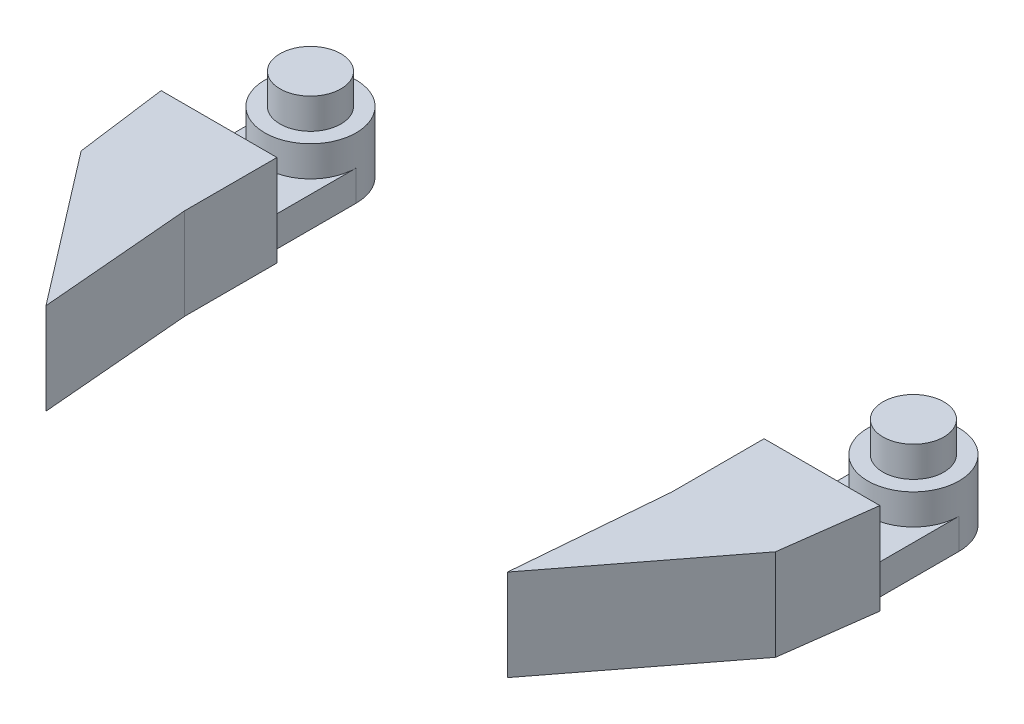
ISO-10303-21;
HEADER;
FILE_DESCRIPTION(('STEP AP214'),'2;1');
FILE_NAME('part.step','',(''),(''),'','','');
FILE_SCHEMA(('AUTOMOTIVE_DESIGN { 1 0 10303 214 1 1 1 1 }'));
ENDSEC;
DATA;
#1=APPLICATION_CONTEXT('core data for automotive mechanical design processes');
#2=APPLICATION_PROTOCOL_DEFINITION('international standard','automotive_design',2000,#1);
#3=PRODUCT_CONTEXT('',#1,'mechanical');
#4=PRODUCT('Part','Part','',(#3));
#5=PRODUCT_RELATED_PRODUCT_CATEGORY('part','',(#4));
#6=PRODUCT_DEFINITION_FORMATION('','',#4);
#7=PRODUCT_DEFINITION_CONTEXT('part definition',#1,'design');
#8=PRODUCT_DEFINITION('design','',#6,#7);
#9=PRODUCT_DEFINITION_SHAPE('','',#8);
#10=(LENGTH_UNIT() NAMED_UNIT(*) SI_UNIT(.MILLI.,.METRE.));
#11=(NAMED_UNIT(*) PLANE_ANGLE_UNIT() SI_UNIT($,.RADIAN.));
#12=(NAMED_UNIT(*) SI_UNIT($,.STERADIAN.) SOLID_ANGLE_UNIT());
#13=UNCERTAINTY_MEASURE_WITH_UNIT(LENGTH_MEASURE(1.E-05),#10,'distance_accuracy_value','');
#14=(GEOMETRIC_REPRESENTATION_CONTEXT(3) GLOBAL_UNCERTAINTY_ASSIGNED_CONTEXT((#13)) GLOBAL_UNIT_ASSIGNED_CONTEXT((#10,
#11,#12)) REPRESENTATION_CONTEXT('',''));
#15=CARTESIAN_POINT('',(0.,0.,0.));
#16=DIRECTION('',(0.,0.,1.));
#17=DIRECTION('',(1.,0.,0.));
#18=AXIS2_PLACEMENT_3D('',#15,#16,#17);
#19=CARTESIAN_POINT('',(98.9290186333893,15.,0.));
#20=DIRECTION('',(0.,-1.,0.));
#21=DIRECTION('',(0.,0.,-1.));
#22=AXIS2_PLACEMENT_3D('',#19,#20,#21);
#23=CYLINDRICAL_SURFACE('',#22,5.);
#24=CARTESIAN_POINT('',(98.9290186333893,10.,0.));
#25=DIRECTION('',(0.,1.,0.));
#26=DIRECTION('',(0.,0.,1.));
#27=AXIS2_PLACEMENT_3D('',#24,#25,#26);
#28=CIRCLE('',#27,5.);
#29=CARTESIAN_POINT('',(98.9290186333893,10.,5.));
#30=VERTEX_POINT('',#29);
#31=EDGE_CURVE('E12',#30,#30,#28,.F.);
#32=ORIENTED_EDGE('',*,*,#31,.F.);
#33=EDGE_LOOP('',(#32));
#34=FACE_BOUND('',#33,.T.);
#35=CARTESIAN_POINT('',(98.9290186333893,15.,0.));
#36=DIRECTION('',(0.,1.,0.));
#37=DIRECTION('',(0.,0.,1.));
#38=AXIS2_PLACEMENT_3D('',#35,#36,#37);
#39=CIRCLE('',#38,5.);
#40=CARTESIAN_POINT('',(98.9290186333893,15.,5.));
#41=VERTEX_POINT('',#40);
#42=EDGE_CURVE('E52',#41,#41,#39,.F.);
#43=ORIENTED_EDGE('',*,*,#42,.T.);
#44=EDGE_LOOP('',(#43));
#45=FACE_BOUND('',#44,.T.);
#46=ADVANCED_FACE('F45',(#34,#45),#23,.T.);
#47=CARTESIAN_POINT('',(0.,15.,0.));
#48=DIRECTION('',(0.,1.,0.));
#49=DIRECTION('',(0.,0.,1.));
#50=AXIS2_PLACEMENT_3D('',#47,#48,#49);
#51=PLANE('',#50);
#52=ORIENTED_EDGE('',*,*,#42,.F.);
#53=EDGE_LOOP('',(#52));
#54=FACE_BOUND('',#53,.T.);
#55=ADVANCED_FACE('F200',(#54),#51,.T.);
#56=CARTESIAN_POINT('',(98.9290186333893,10.,0.));
#57=DIRECTION('',(0.,-1.,0.));
#58=DIRECTION('',(0.,0.,-1.));
#59=AXIS2_PLACEMENT_3D('',#56,#57,#58);
#60=CYLINDRICAL_SURFACE('',#59,7.5);
#61=DIRECTION('',(0.,-1.,0.));
#62=VECTOR('',#61,1.);
#63=CARTESIAN_POINT('',(106.429018633389,5.,0.));
#64=LINE('',#63,#62);
#65=CARTESIAN_POINT('',(106.429018633389,5.,0.));
#66=VERTEX_POINT('',#65);
#67=CARTESIAN_POINT('',(106.429018633389,0.,0.));
#68=VERTEX_POINT('',#67);
#69=EDGE_CURVE('E85',#66,#68,#64,.T.);
#70=ORIENTED_EDGE('',*,*,#69,.T.);
#71=CARTESIAN_POINT('',(98.9290186333893,0.,0.));
#72=DIRECTION('',(0.,1.,0.));
#73=DIRECTION('',(0.,0.,1.));
#74=AXIS2_PLACEMENT_3D('',#71,#72,#73);
#75=CIRCLE('',#74,7.5);
#76=CARTESIAN_POINT('',(91.4290186333893,0.,0.));
#77=VERTEX_POINT('',#76);
#78=EDGE_CURVE('E192',#77,#68,#75,.F.);
#79=ORIENTED_EDGE('',*,*,#78,.F.);
#80=DIRECTION('',(0.,-1.,0.));
#81=VECTOR('',#80,1.);
#82=CARTESIAN_POINT('',(91.4290186333893,5.,0.));
#83=LINE('',#82,#81);
#84=CARTESIAN_POINT('',(91.4290186333893,5.,0.));
#85=VERTEX_POINT('',#84);
#86=EDGE_CURVE('E189',#85,#77,#83,.T.);
#87=ORIENTED_EDGE('',*,*,#86,.F.);
#88=CARTESIAN_POINT('',(98.9290186333893,5.,0.));
#89=DIRECTION('',(0.,1.,0.));
#90=DIRECTION('',(0.,0.,1.));
#91=AXIS2_PLACEMENT_3D('',#88,#89,#90);
#92=CIRCLE('',#91,7.5);
#93=EDGE_CURVE('E176',#66,#85,#92,.F.);
#94=ORIENTED_EDGE('',*,*,#93,.F.);
#95=EDGE_LOOP('',(#70,#79,#87,#94));
#96=FACE_BOUND('',#95,.T.);
#97=CARTESIAN_POINT('',(98.9290186333893,10.,0.));
#98=DIRECTION('',(0.,1.,0.));
#99=DIRECTION('',(0.,0.,1.));
#100=AXIS2_PLACEMENT_3D('',#97,#98,#99);
#101=CIRCLE('',#100,7.5);
#102=CARTESIAN_POINT('',(98.9290186333893,10.,7.5));
#103=VERTEX_POINT('',#102);
#104=EDGE_CURVE('E193',#103,#103,#101,.F.);
#105=ORIENTED_EDGE('',*,*,#104,.T.);
#106=EDGE_LOOP('',(#105));
#107=FACE_BOUND('',#106,.T.);
#108=ADVANCED_FACE('F202',(#96,#107),#60,.T.);
#109=CARTESIAN_POINT('',(0.,10.,0.));
#110=DIRECTION('',(0.,1.,0.));
#111=DIRECTION('',(0.,0.,1.));
#112=AXIS2_PLACEMENT_3D('',#109,#110,#111);
#113=PLANE('',#112);
#114=ORIENTED_EDGE('',*,*,#31,.T.);
#115=EDGE_LOOP('',(#114));
#116=FACE_BOUND('',#115,.T.);
#117=ORIENTED_EDGE('',*,*,#104,.F.);
#118=EDGE_LOOP('',(#117));
#119=FACE_BOUND('',#118,.T.);
#120=ADVANCED_FACE('F208',(#116,#119),#113,.T.);
#121=CARTESIAN_POINT('',(0.,0.,0.));
#122=DIRECTION('',(0.,1.,0.));
#123=DIRECTION('',(0.,0.,1.));
#124=AXIS2_PLACEMENT_3D('',#121,#122,#123);
#125=PLANE('',#124);
#126=ORIENTED_EDGE('',*,*,#78,.T.);
#127=DIRECTION('',(0.,0.,1.));
#128=VECTOR('',#127,1.);
#129=CARTESIAN_POINT('',(106.429018633389,0.,0.));
#130=LINE('',#129,#128);
#131=CARTESIAN_POINT('',(106.429018633389,0.,15.));
#132=VERTEX_POINT('',#131);
#133=EDGE_CURVE('E132',#68,#132,#130,.T.);
#134=ORIENTED_EDGE('',*,*,#133,.T.);
#135=DIRECTION('',(1.,0.,0.));
#136=VECTOR('',#135,1.);
#137=CARTESIAN_POINT('',(0.,0.,15.));
#138=LINE('',#137,#136);
#139=CARTESIAN_POINT('',(108.429018633389,0.,15.));
#140=VERTEX_POINT('',#139);
#141=EDGE_CURVE('E158',#132,#140,#138,.T.);
#142=ORIENTED_EDGE('',*,*,#141,.T.);
#143=DIRECTION('',(-0.131071920752448,0.,0.991372862040445));
#144=VECTOR('',#143,1.);
#145=CARTESIAN_POINT('',(108.515341708194,0.,14.3470885813101));
#146=LINE('',#145,#144);
#147=CARTESIAN_POINT('',(106.429018633389,0.,30.1271585302061));
#148=VERTEX_POINT('',#147);
#149=EDGE_CURVE('E128',#140,#148,#146,.T.);
#150=ORIENTED_EDGE('',*,*,#149,.T.);
#151=DIRECTION('',(-0.609198044114665,0.,0.793018122773286));
#152=VECTOR('',#151,1.);
#153=CARTESIAN_POINT('',(81.4854246461835,0.,62.5972596246702));
#154=LINE('',#153,#152);
#155=CARTESIAN_POINT('',(87.3216540728135,0.,55.));
#156=VERTEX_POINT('',#155);
#157=EDGE_CURVE('E144',#148,#156,#154,.T.);
#158=ORIENTED_EDGE('',*,*,#157,.T.);
#159=DIRECTION('',(0.0844230553486425,0.,-0.996430001417862));
#160=VECTOR('',#159,1.);
#161=CARTESIAN_POINT('',(91.3259821990599,0.,7.73764182028789));
#162=LINE('',#161,#160);
#163=CARTESIAN_POINT('',(89.4290186333893,0.,30.1271585302061));
#164=VERTEX_POINT('',#163);
#165=EDGE_CURVE('E164',#156,#164,#162,.T.);
#166=ORIENTED_EDGE('',*,*,#165,.T.);
#167=DIRECTION('',(0.,0.,-1.));
#168=VECTOR('',#167,1.);
#169=CARTESIAN_POINT('',(89.4290186333893,0.,0.));
#170=LINE('',#169,#168);
#171=CARTESIAN_POINT('',(89.4290186333893,0.,15.));
#172=VERTEX_POINT('',#171);
#173=EDGE_CURVE('E161',#164,#172,#170,.T.);
#174=ORIENTED_EDGE('',*,*,#173,.T.);
#175=CARTESIAN_POINT('',(91.4290186333893,0.,15.));
#176=VERTEX_POINT('',#175);
#177=EDGE_CURVE('E159',#172,#176,#138,.T.);
#178=ORIENTED_EDGE('',*,*,#177,.T.);
#179=DIRECTION('',(0.,0.,1.));
#180=VECTOR('',#179,1.);
#181=CARTESIAN_POINT('',(91.4290186333893,0.,0.));
#182=LINE('',#181,#180);
#183=EDGE_CURVE('E59',#77,#176,#182,.T.);
#184=ORIENTED_EDGE('',*,*,#183,.F.);
#185=EDGE_LOOP('',(#126,#134,#142,#150,#158,#166,#174,#178,#184));
#186=FACE_BOUND('',#185,.T.);
#187=ADVANCED_FACE('F213',(#186),#125,.F.);
#188=CARTESIAN_POINT('',(106.429018633389,5.,0.));
#189=DIRECTION('',(1.,0.,0.));
#190=DIRECTION('',(0.,0.,-1.));
#191=AXIS2_PLACEMENT_3D('',#188,#189,#190);
#192=PLANE('',#191);
#193=ORIENTED_EDGE('',*,*,#133,.F.);
#194=ORIENTED_EDGE('',*,*,#69,.F.);
#195=DIRECTION('',(0.,0.,1.));
#196=VECTOR('',#195,1.);
#197=CARTESIAN_POINT('',(106.429018633389,5.,0.));
#198=LINE('',#197,#196);
#199=CARTESIAN_POINT('',(106.429018633389,5.,15.));
#200=VERTEX_POINT('',#199);
#201=EDGE_CURVE('E68',#66,#200,#198,.T.);
#202=ORIENTED_EDGE('',*,*,#201,.T.);
#203=DIRECTION('',(0.,-1.,0.));
#204=VECTOR('',#203,1.);
#205=CARTESIAN_POINT('',(106.429018633389,5.,15.));
#206=LINE('',#205,#204);
#207=EDGE_CURVE('E81',#200,#132,#206,.T.);
#208=ORIENTED_EDGE('',*,*,#207,.T.);
#209=EDGE_LOOP('',(#193,#194,#202,#208));
#210=FACE_BOUND('',#209,.T.);
#211=ADVANCED_FACE('F215',(#210),#192,.T.);
#212=CARTESIAN_POINT('',(91.4290186333893,5.,0.));
#213=DIRECTION('',(1.,0.,0.));
#214=DIRECTION('',(0.,0.,-1.));
#215=AXIS2_PLACEMENT_3D('',#212,#213,#214);
#216=PLANE('',#215);
#217=ORIENTED_EDGE('',*,*,#183,.T.);
#218=DIRECTION('',(0.,-1.,0.));
#219=VECTOR('',#218,1.);
#220=CARTESIAN_POINT('',(91.4290186333893,5.,15.));
#221=LINE('',#220,#219);
#222=CARTESIAN_POINT('',(91.4290186333893,5.,15.));
#223=VERTEX_POINT('',#222);
#224=EDGE_CURVE('E186',#223,#176,#221,.T.);
#225=ORIENTED_EDGE('',*,*,#224,.F.);
#226=DIRECTION('',(0.,0.,1.));
#227=VECTOR('',#226,1.);
#228=CARTESIAN_POINT('',(91.4290186333893,5.,0.));
#229=LINE('',#228,#227);
#230=EDGE_CURVE('E178',#85,#223,#229,.T.);
#231=ORIENTED_EDGE('',*,*,#230,.F.);
#232=ORIENTED_EDGE('',*,*,#86,.T.);
#233=EDGE_LOOP('',(#217,#225,#231,#232));
#234=FACE_BOUND('',#233,.T.);
#235=ADVANCED_FACE('F220',(#234),#216,.F.);
#236=CARTESIAN_POINT('',(0.,5.,0.));
#237=DIRECTION('',(0.,1.,0.));
#238=DIRECTION('',(0.,0.,1.));
#239=AXIS2_PLACEMENT_3D('',#236,#237,#238);
#240=PLANE('',#239);
#241=ORIENTED_EDGE('',*,*,#201,.F.);
#242=ORIENTED_EDGE('',*,*,#93,.T.);
#243=ORIENTED_EDGE('',*,*,#230,.T.);
#244=DIRECTION('',(-1.,0.,0.));
#245=VECTOR('',#244,1.);
#246=CARTESIAN_POINT('',(0.,5.,15.));
#247=LINE('',#246,#245);
#248=EDGE_CURVE('E180',#200,#223,#247,.T.);
#249=ORIENTED_EDGE('',*,*,#248,.F.);
#250=EDGE_LOOP('',(#241,#242,#243,#249));
#251=FACE_BOUND('',#250,.T.);
#252=ADVANCED_FACE('F229',(#251),#240,.T.);
#253=CARTESIAN_POINT('',(0.,15.,15.));
#254=DIRECTION('',(0.,0.,-1.));
#255=DIRECTION('',(-1.,0.,0.));
#256=AXIS2_PLACEMENT_3D('',#253,#254,#255);
#257=PLANE('',#256);
#258=ORIENTED_EDGE('',*,*,#207,.F.);
#259=ORIENTED_EDGE('',*,*,#248,.T.);
#260=ORIENTED_EDGE('',*,*,#224,.T.);
#261=ORIENTED_EDGE('',*,*,#177,.F.);
#262=DIRECTION('',(0.,-1.,0.));
#263=VECTOR('',#262,1.);
#264=CARTESIAN_POINT('',(89.4290186333893,15.,15.));
#265=LINE('',#264,#263);
#266=CARTESIAN_POINT('',(89.4290186333893,15.,15.));
#267=VERTEX_POINT('',#266);
#268=EDGE_CURVE('E133',#267,#172,#265,.T.);
#269=ORIENTED_EDGE('',*,*,#268,.F.);
#270=DIRECTION('',(1.,0.,0.));
#271=VECTOR('',#270,1.);
#272=CARTESIAN_POINT('',(0.,15.,15.));
#273=LINE('',#272,#271);
#274=CARTESIAN_POINT('',(108.429018633389,15.,15.));
#275=VERTEX_POINT('',#274);
#276=EDGE_CURVE('E139',#267,#275,#273,.T.);
#277=ORIENTED_EDGE('',*,*,#276,.T.);
#278=DIRECTION('',(0.,-1.,0.));
#279=VECTOR('',#278,1.);
#280=CARTESIAN_POINT('',(108.429018633389,15.,15.));
#281=LINE('',#280,#279);
#282=EDGE_CURVE('E122',#275,#140,#281,.T.);
#283=ORIENTED_EDGE('',*,*,#282,.T.);
#284=ORIENTED_EDGE('',*,*,#141,.F.);
#285=EDGE_LOOP('',(#258,#259,#260,#261,#269,#277,#283,#284));
#286=FACE_BOUND('',#285,.T.);
#287=ADVANCED_FACE('F146',(#286),#257,.T.);
#288=CARTESIAN_POINT('',(108.515341708194,15.,14.3470885813101));
#289=DIRECTION('',(0.991372862040445,0.,0.131071920752448));
#290=DIRECTION('',(0.131071920752448,0.,-0.991372862040445));
#291=AXIS2_PLACEMENT_3D('',#288,#289,#290);
#292=PLANE('',#291);
#293=ORIENTED_EDGE('',*,*,#149,.F.);
#294=ORIENTED_EDGE('',*,*,#282,.F.);
#295=DIRECTION('',(-0.131071920752448,0.,0.991372862040445));
#296=VECTOR('',#295,1.);
#297=CARTESIAN_POINT('',(108.515341708194,15.,14.3470885813101));
#298=LINE('',#297,#296);
#299=CARTESIAN_POINT('',(106.429018633389,15.,30.1271585302061));
#300=VERTEX_POINT('',#299);
#301=EDGE_CURVE('E125',#275,#300,#298,.T.);
#302=ORIENTED_EDGE('',*,*,#301,.T.);
#303=DIRECTION('',(0.,-1.,0.));
#304=VECTOR('',#303,1.);
#305=CARTESIAN_POINT('',(106.429018633389,15.,30.1271585302061));
#306=LINE('',#305,#304);
#307=EDGE_CURVE('E156',#300,#148,#306,.T.);
#308=ORIENTED_EDGE('',*,*,#307,.T.);
#309=EDGE_LOOP('',(#293,#294,#302,#308));
#310=FACE_BOUND('',#309,.T.);
#311=ADVANCED_FACE('F124',(#310),#292,.T.);
#312=CARTESIAN_POINT('',(89.4290186333893,15.,0.));
#313=DIRECTION('',(-1.,0.,0.));
#314=DIRECTION('',(0.,0.,1.));
#315=AXIS2_PLACEMENT_3D('',#312,#313,#314);
#316=PLANE('',#315);
#317=ORIENTED_EDGE('',*,*,#173,.F.);
#318=DIRECTION('',(0.,-1.,0.));
#319=VECTOR('',#318,1.);
#320=CARTESIAN_POINT('',(89.4290186333893,15.,30.1271585302061));
#321=LINE('',#320,#319);
#322=CARTESIAN_POINT('',(89.4290186333893,15.,30.1271585302061));
#323=VERTEX_POINT('',#322);
#324=EDGE_CURVE('E172',#323,#164,#321,.T.);
#325=ORIENTED_EDGE('',*,*,#324,.F.);
#326=DIRECTION('',(0.,0.,-1.));
#327=VECTOR('',#326,1.);
#328=CARTESIAN_POINT('',(89.4290186333893,15.,0.));
#329=LINE('',#328,#327);
#330=EDGE_CURVE('E148',#323,#267,#329,.T.);
#331=ORIENTED_EDGE('',*,*,#330,.T.);
#332=ORIENTED_EDGE('',*,*,#268,.T.);
#333=EDGE_LOOP('',(#317,#325,#331,#332));
#334=FACE_BOUND('',#333,.T.);
#335=ADVANCED_FACE('F240',(#334),#316,.T.);
#336=CARTESIAN_POINT('',(91.3259821990599,15.,7.73764182028789));
#337=DIRECTION('',(-0.996430001417862,0.,-0.0844230553486425));
#338=DIRECTION('',(-0.0844230553486425,0.,0.996430001417862));
#339=AXIS2_PLACEMENT_3D('',#336,#337,#338);
#340=PLANE('',#339);
#341=ORIENTED_EDGE('',*,*,#165,.F.);
#342=DIRECTION('',(0.,-1.,0.));
#343=VECTOR('',#342,1.);
#344=CARTESIAN_POINT('',(87.3216540728135,15.,55.));
#345=LINE('',#344,#343);
#346=CARTESIAN_POINT('',(87.3216540728135,15.,55.));
#347=VERTEX_POINT('',#346);
#348=EDGE_CURVE('E170',#347,#156,#345,.T.);
#349=ORIENTED_EDGE('',*,*,#348,.F.);
#350=DIRECTION('',(0.0844230553486425,0.,-0.996430001417862));
#351=VECTOR('',#350,1.);
#352=CARTESIAN_POINT('',(91.3259821990599,15.,7.73764182028789));
#353=LINE('',#352,#351);
#354=EDGE_CURVE('E150',#347,#323,#353,.T.);
#355=ORIENTED_EDGE('',*,*,#354,.T.);
#356=ORIENTED_EDGE('',*,*,#324,.T.);
#357=EDGE_LOOP('',(#341,#349,#355,#356));
#358=FACE_BOUND('',#357,.T.);
#359=ADVANCED_FACE('F237',(#358),#340,.T.);
#360=CARTESIAN_POINT('',(81.4854246461835,15.,62.5972596246702));
#361=DIRECTION('',(0.793018122773286,0.,0.609198044114665));
#362=DIRECTION('',(0.609198044114665,0.,-0.793018122773286));
#363=AXIS2_PLACEMENT_3D('',#360,#361,#362);
#364=PLANE('',#363);
#365=ORIENTED_EDGE('',*,*,#157,.F.);
#366=ORIENTED_EDGE('',*,*,#307,.F.);
#367=DIRECTION('',(-0.609198044114665,0.,0.793018122773286));
#368=VECTOR('',#367,1.);
#369=CARTESIAN_POINT('',(81.4854246461835,15.,62.5972596246702));
#370=LINE('',#369,#368);
#371=EDGE_CURVE('E143',#300,#347,#370,.T.);
#372=ORIENTED_EDGE('',*,*,#371,.T.);
#373=ORIENTED_EDGE('',*,*,#348,.T.);
#374=EDGE_LOOP('',(#365,#366,#372,#373));
#375=FACE_BOUND('',#374,.T.);
#376=ADVANCED_FACE('F234',(#375),#364,.T.);
#377=CARTESIAN_POINT('',(0.,15.,0.));
#378=DIRECTION('',(0.,1.,0.));
#379=DIRECTION('',(0.,0.,1.));
#380=AXIS2_PLACEMENT_3D('',#377,#378,#379);
#381=PLANE('',#380);
#382=ORIENTED_EDGE('',*,*,#301,.F.);
#383=ORIENTED_EDGE('',*,*,#276,.F.);
#384=ORIENTED_EDGE('',*,*,#330,.F.);
#385=ORIENTED_EDGE('',*,*,#354,.F.);
#386=ORIENTED_EDGE('',*,*,#371,.F.);
#387=EDGE_LOOP('',(#382,#383,#384,#385,#386));
#388=FACE_BOUND('',#387,.T.);
#389=ADVANCED_FACE('F137',(#388),#381,.T.);
#390=CLOSED_SHELL('',(#46,#55,#108,#120,#187,#211,#235,#252,#287,#311,#335,#359,#376,#389));
#391=MANIFOLD_SOLID_BREP('B2',#390);
#392=CARTESIAN_POINT('',(0.,10.,0.));
#393=DIRECTION('',(0.,-1.,0.));
#394=DIRECTION('',(0.,0.,-1.));
#395=AXIS2_PLACEMENT_3D('',#392,#393,#394);
#396=CYLINDRICAL_SURFACE('',#395,7.5);
#397=CARTESIAN_POINT('',(0.,10.,0.));
#398=DIRECTION('',(0.,1.,0.));
#399=DIRECTION('',(0.,0.,1.));
#400=AXIS2_PLACEMENT_3D('',#397,#398,#399);
#401=CIRCLE('',#400,7.5);
#402=CARTESIAN_POINT('',(0.,10.,7.5));
#403=VERTEX_POINT('',#402);
#404=EDGE_CURVE('E43',#403,#403,#401,.T.);
#405=ORIENTED_EDGE('',*,*,#404,.F.);
#406=EDGE_LOOP('',(#405));
#407=FACE_BOUND('',#406,.T.);
#408=DIRECTION('',(0.,-1.,0.));
#409=VECTOR('',#408,1.);
#410=CARTESIAN_POINT('',(-7.5,5.,0.));
#411=LINE('',#410,#409);
#412=CARTESIAN_POINT('',(-7.5,5.,0.));
#413=VERTEX_POINT('',#412);
#414=CARTESIAN_POINT('',(-7.5,0.,0.));
#415=VERTEX_POINT('',#414);
#416=EDGE_CURVE('E387',#413,#415,#411,.T.);
#417=ORIENTED_EDGE('',*,*,#416,.F.);
#418=CARTESIAN_POINT('',(0.,5.,0.));
#419=DIRECTION('',(0.,1.,0.));
#420=DIRECTION('',(0.,0.,1.));
#421=AXIS2_PLACEMENT_3D('',#418,#419,#420);
#422=CIRCLE('',#421,7.5);
#423=CARTESIAN_POINT('',(7.5,5.,0.));
#424=VERTEX_POINT('',#423);
#425=EDGE_CURVE('E382',#413,#424,#422,.T.);
#426=ORIENTED_EDGE('',*,*,#425,.T.);
#427=DIRECTION('',(0.,-1.,0.));
#428=VECTOR('',#427,1.);
#429=CARTESIAN_POINT('',(7.5,5.,0.));
#430=LINE('',#429,#428);
#431=CARTESIAN_POINT('',(7.5,0.,0.));
#432=VERTEX_POINT('',#431);
#433=EDGE_CURVE('E481',#424,#432,#430,.T.);
#434=ORIENTED_EDGE('',*,*,#433,.T.);
#435=CARTESIAN_POINT('',(0.,0.,0.));
#436=DIRECTION('',(0.,1.,0.));
#437=DIRECTION('',(0.,0.,1.));
#438=AXIS2_PLACEMENT_3D('',#435,#436,#437);
#439=CIRCLE('',#438,7.5);
#440=EDGE_CURVE('E370',#432,#415,#439,.T.);
#441=ORIENTED_EDGE('',*,*,#440,.T.);
#442=EDGE_LOOP('',(#417,#426,#434,#441));
#443=FACE_BOUND('',#442,.T.);
#444=ADVANCED_FACE('F367',(#407,#443),#396,.T.);
#445=CARTESIAN_POINT('',(0.,10.,0.));
#446=DIRECTION('',(0.,1.,0.));
#447=DIRECTION('',(0.,0.,1.));
#448=AXIS2_PLACEMENT_3D('',#445,#446,#447);
#449=PLANE('',#448);
#450=CARTESIAN_POINT('',(0.,10.,0.));
#451=DIRECTION('',(0.,1.,0.));
#452=DIRECTION('',(0.,0.,1.));
#453=AXIS2_PLACEMENT_3D('',#450,#451,#452);
#454=CIRCLE('',#453,5.);
#455=CARTESIAN_POINT('',(0.,10.,5.));
#456=VERTEX_POINT('',#455);
#457=EDGE_CURVE('E375',#456,#456,#454,.T.);
#458=ORIENTED_EDGE('',*,*,#457,.F.);
#459=EDGE_LOOP('',(#458));
#460=FACE_BOUND('',#459,.T.);
#461=ORIENTED_EDGE('',*,*,#404,.T.);
#462=EDGE_LOOP('',(#461));
#463=FACE_BOUND('',#462,.T.);
#464=ADVANCED_FACE('F550',(#460,#463),#449,.T.);
#465=CARTESIAN_POINT('',(0.,0.,0.));
#466=DIRECTION('',(0.,1.,0.));
#467=DIRECTION('',(0.,0.,1.));
#468=AXIS2_PLACEMENT_3D('',#465,#466,#467);
#469=PLANE('',#468);
#470=ORIENTED_EDGE('',*,*,#440,.F.);
#471=DIRECTION('',(0.,0.,1.));
#472=VECTOR('',#471,1.);
#473=CARTESIAN_POINT('',(7.5,0.,0.));
#474=LINE('',#473,#472);
#475=CARTESIAN_POINT('',(7.5,0.,15.));
#476=VERTEX_POINT('',#475);
#477=EDGE_CURVE('E467',#432,#476,#474,.T.);
#478=ORIENTED_EDGE('',*,*,#477,.T.);
#479=DIRECTION('',(-1.,0.,0.));
#480=VECTOR('',#479,1.);
#481=CARTESIAN_POINT('',(0.,0.,15.));
#482=LINE('',#481,#480);
#483=CARTESIAN_POINT('',(9.49999999999999,0.,15.));
#484=VERTEX_POINT('',#483);
#485=EDGE_CURVE('E507',#484,#476,#482,.T.);
#486=ORIENTED_EDGE('',*,*,#485,.F.);
#487=DIRECTION('',(0.,0.,-1.));
#488=VECTOR('',#487,1.);
#489=CARTESIAN_POINT('',(9.49999999999999,0.,0.));
#490=LINE('',#489,#488);
#491=CARTESIAN_POINT('',(9.5,0.,30.1271585302061));
#492=VERTEX_POINT('',#491);
#493=EDGE_CURVE('E464',#492,#484,#490,.T.);
#494=ORIENTED_EDGE('',*,*,#493,.F.);
#495=DIRECTION('',(-0.0844230553486425,0.,-0.996430001417862));
#496=VECTOR('',#495,1.);
#497=CARTESIAN_POINT('',(6.89794436127043,0.,-0.584431959871487));
#498=LINE('',#497,#496);
#499=CARTESIAN_POINT('',(11.6073645605757,0.,55.));
#500=VERTEX_POINT('',#499);
#501=EDGE_CURVE('E460',#500,#492,#498,.T.);
#502=ORIENTED_EDGE('',*,*,#501,.F.);
#503=DIRECTION('',(0.609198044114665,0.,0.793018122773286));
#504=VECTOR('',#503,1.);
#505=CARTESIAN_POINT('',(-19.2711666861763,0.,14.8041472393722));
#506=LINE('',#505,#504);
#507=CARTESIAN_POINT('',(-7.5,0.,30.1271585302061));
#508=VERTEX_POINT('',#507);
#509=EDGE_CURVE('E514',#508,#500,#506,.T.);
#510=ORIENTED_EDGE('',*,*,#509,.F.);
#511=DIRECTION('',(0.131071920752449,0.,0.991372862040445));
#512=VECTOR('',#511,1.);
#513=CARTESIAN_POINT('',(-11.2859086182499,0.,1.49213860563623));
#514=LINE('',#513,#512);
#515=CARTESIAN_POINT('',(-9.50000000000001,0.,15.));
#516=VERTEX_POINT('',#515);
#517=EDGE_CURVE('E506',#516,#508,#514,.T.);
#518=ORIENTED_EDGE('',*,*,#517,.F.);
#519=CARTESIAN_POINT('',(-7.5,0.,15.));
#520=VERTEX_POINT('',#519);
#521=EDGE_CURVE('E504',#520,#516,#482,.T.);
#522=ORIENTED_EDGE('',*,*,#521,.F.);
#523=DIRECTION('',(0.,0.,1.));
#524=VECTOR('',#523,1.);
#525=CARTESIAN_POINT('',(-7.5,0.,0.));
#526=LINE('',#525,#524);
#527=EDGE_CURVE('E465',#415,#520,#526,.T.);
#528=ORIENTED_EDGE('',*,*,#527,.F.);
#529=EDGE_LOOP('',(#470,#478,#486,#494,#502,#510,#518,#522,#528));
#530=FACE_BOUND('',#529,.T.);
#531=ADVANCED_FACE('F502',(#530),#469,.F.);
#532=CARTESIAN_POINT('',(-7.5,5.,0.));
#533=DIRECTION('',(1.,0.,0.));
#534=DIRECTION('',(0.,0.,-1.));
#535=AXIS2_PLACEMENT_3D('',#532,#533,#534);
#536=PLANE('',#535);
#537=ORIENTED_EDGE('',*,*,#527,.T.);
#538=DIRECTION('',(0.,-1.,0.));
#539=VECTOR('',#538,1.);
#540=CARTESIAN_POINT('',(-7.5,5.,15.));
#541=LINE('',#540,#539);
#542=CARTESIAN_POINT('',(-7.5,5.,15.));
#543=VERTEX_POINT('',#542);
#544=EDGE_CURVE('E488',#543,#520,#541,.T.);
#545=ORIENTED_EDGE('',*,*,#544,.F.);
#546=DIRECTION('',(0.,0.,1.));
#547=VECTOR('',#546,1.);
#548=CARTESIAN_POINT('',(-7.5,5.,0.));
#549=LINE('',#548,#547);
#550=EDGE_CURVE('E474',#413,#543,#549,.T.);
#551=ORIENTED_EDGE('',*,*,#550,.F.);
#552=ORIENTED_EDGE('',*,*,#416,.T.);
#553=EDGE_LOOP('',(#537,#545,#551,#552));
#554=FACE_BOUND('',#553,.T.);
#555=ADVANCED_FACE('F499',(#554),#536,.F.);
#556=CARTESIAN_POINT('',(7.5,5.,0.));
#557=DIRECTION('',(1.,0.,0.));
#558=DIRECTION('',(0.,0.,-1.));
#559=AXIS2_PLACEMENT_3D('',#556,#557,#558);
#560=PLANE('',#559);
#561=ORIENTED_EDGE('',*,*,#477,.F.);
#562=ORIENTED_EDGE('',*,*,#433,.F.);
#563=DIRECTION('',(0.,0.,1.));
#564=VECTOR('',#563,1.);
#565=CARTESIAN_POINT('',(7.5,5.,0.));
#566=LINE('',#565,#564);
#567=CARTESIAN_POINT('',(7.5,5.,15.));
#568=VERTEX_POINT('',#567);
#569=EDGE_CURVE('E479',#424,#568,#566,.T.);
#570=ORIENTED_EDGE('',*,*,#569,.T.);
#571=DIRECTION('',(0.,-1.,0.));
#572=VECTOR('',#571,1.);
#573=CARTESIAN_POINT('',(7.5,5.,15.));
#574=LINE('',#573,#572);
#575=EDGE_CURVE('E486',#568,#476,#574,.T.);
#576=ORIENTED_EDGE('',*,*,#575,.T.);
#577=EDGE_LOOP('',(#561,#562,#570,#576));
#578=FACE_BOUND('',#577,.T.);
#579=ADVANCED_FACE('F565',(#578),#560,.T.);
#580=CARTESIAN_POINT('',(0.,5.,0.));
#581=DIRECTION('',(0.,1.,0.));
#582=DIRECTION('',(0.,0.,1.));
#583=AXIS2_PLACEMENT_3D('',#580,#581,#582);
#584=PLANE('',#583);
#585=ORIENTED_EDGE('',*,*,#425,.F.);
#586=ORIENTED_EDGE('',*,*,#550,.T.);
#587=DIRECTION('',(-1.,0.,0.));
#588=VECTOR('',#587,1.);
#589=CARTESIAN_POINT('',(0.,5.,15.));
#590=LINE('',#589,#588);
#591=EDGE_CURVE('E476',#568,#543,#590,.T.);
#592=ORIENTED_EDGE('',*,*,#591,.F.);
#593=ORIENTED_EDGE('',*,*,#569,.F.);
#594=EDGE_LOOP('',(#585,#586,#592,#593));
#595=FACE_BOUND('',#594,.T.);
#596=ADVANCED_FACE('F568',(#595),#584,.T.);
#597=CARTESIAN_POINT('',(9.49999999999999,15.,0.));
#598=DIRECTION('',(-1.,0.,0.));
#599=DIRECTION('',(0.,0.,1.));
#600=AXIS2_PLACEMENT_3D('',#597,#598,#599);
#601=PLANE('',#600);
#602=ORIENTED_EDGE('',*,*,#493,.T.);
#603=DIRECTION('',(0.,-1.,0.));
#604=VECTOR('',#603,1.);
#605=CARTESIAN_POINT('',(9.49999999999999,15.,15.));
#606=LINE('',#605,#604);
#607=CARTESIAN_POINT('',(9.49999999999999,15.,15.));
#608=VERTEX_POINT('',#607);
#609=EDGE_CURVE('E444',#608,#484,#606,.T.);
#610=ORIENTED_EDGE('',*,*,#609,.F.);
#611=DIRECTION('',(0.,0.,-1.));
#612=VECTOR('',#611,1.);
#613=CARTESIAN_POINT('',(9.49999999999999,15.,0.));
#614=LINE('',#613,#612);
#615=CARTESIAN_POINT('',(9.5,15.,30.1271585302061));
#616=VERTEX_POINT('',#615);
#617=EDGE_CURVE('E451',#616,#608,#614,.T.);
#618=ORIENTED_EDGE('',*,*,#617,.F.);
#619=DIRECTION('',(0.,-1.,0.));
#620=VECTOR('',#619,1.);
#621=CARTESIAN_POINT('',(9.5,15.,30.1271585302061));
#622=LINE('',#621,#620);
#623=EDGE_CURVE('E517',#616,#492,#622,.T.);
#624=ORIENTED_EDGE('',*,*,#623,.T.);
#625=EDGE_LOOP('',(#602,#610,#618,#624));
#626=FACE_BOUND('',#625,.T.);
#627=ADVANCED_FACE('F462',(#626),#601,.F.);
#628=CARTESIAN_POINT('',(0.,15.,15.));
#629=DIRECTION('',(0.,0.,1.));
#630=DIRECTION('',(1.,0.,0.));
#631=AXIS2_PLACEMENT_3D('',#628,#629,#630);
#632=PLANE('',#631);
#633=ORIENTED_EDGE('',*,*,#575,.F.);
#634=ORIENTED_EDGE('',*,*,#591,.T.);
#635=ORIENTED_EDGE('',*,*,#544,.T.);
#636=ORIENTED_EDGE('',*,*,#521,.T.);
#637=DIRECTION('',(0.,-1.,0.));
#638=VECTOR('',#637,1.);
#639=CARTESIAN_POINT('',(-9.50000000000001,15.,15.));
#640=LINE('',#639,#638);
#641=CARTESIAN_POINT('',(-9.50000000000001,15.,15.));
#642=VERTEX_POINT('',#641);
#643=EDGE_CURVE('E447',#642,#516,#640,.T.);
#644=ORIENTED_EDGE('',*,*,#643,.F.);
#645=DIRECTION('',(-1.,0.,0.));
#646=VECTOR('',#645,1.);
#647=CARTESIAN_POINT('',(0.,15.,15.));
#648=LINE('',#647,#646);
#649=EDGE_CURVE('E438',#608,#642,#648,.T.);
#650=ORIENTED_EDGE('',*,*,#649,.F.);
#651=ORIENTED_EDGE('',*,*,#609,.T.);
#652=ORIENTED_EDGE('',*,*,#485,.T.);
#653=EDGE_LOOP('',(#633,#634,#635,#636,#644,#650,#651,#652));
#654=FACE_BOUND('',#653,.T.);
#655=ADVANCED_FACE('F441',(#654),#632,.F.);
#656=CARTESIAN_POINT('',(-11.2859086182499,15.,1.49213860563623));
#657=DIRECTION('',(0.991372862040445,0.,-0.131071920752448));
#658=DIRECTION('',(-0.131071920752449,0.,-0.991372862040445));
#659=AXIS2_PLACEMENT_3D('',#656,#657,#658);
#660=PLANE('',#659);
#661=ORIENTED_EDGE('',*,*,#517,.T.);
#662=DIRECTION('',(0.,-1.,0.));
#663=VECTOR('',#662,1.);
#664=CARTESIAN_POINT('',(-7.5,15.,30.1271585302061));
#665=LINE('',#664,#663);
#666=CARTESIAN_POINT('',(-7.5,15.,30.1271585302061));
#667=VERTEX_POINT('',#666);
#668=EDGE_CURVE('E469',#667,#508,#665,.T.);
#669=ORIENTED_EDGE('',*,*,#668,.F.);
#670=DIRECTION('',(0.131071920752449,0.,0.991372862040445));
#671=VECTOR('',#670,1.);
#672=CARTESIAN_POINT('',(-11.2859086182499,15.,1.49213860563623));
#673=LINE('',#672,#671);
#674=EDGE_CURVE('E450',#642,#667,#673,.T.);
#675=ORIENTED_EDGE('',*,*,#674,.F.);
#676=ORIENTED_EDGE('',*,*,#643,.T.);
#677=EDGE_LOOP('',(#661,#669,#675,#676));
#678=FACE_BOUND('',#677,.T.);
#679=ADVANCED_FACE('F577',(#678),#660,.F.);
#680=CARTESIAN_POINT('',(-19.2711666861763,15.,14.8041472393722));
#681=DIRECTION('',(0.793018122773286,0.,-0.609198044114665));
#682=DIRECTION('',(-0.609198044114665,0.,-0.793018122773286));
#683=AXIS2_PLACEMENT_3D('',#680,#681,#682);
#684=PLANE('',#683);
#685=ORIENTED_EDGE('',*,*,#509,.T.);
#686=DIRECTION('',(0.,-1.,0.));
#687=VECTOR('',#686,1.);
#688=CARTESIAN_POINT('',(11.6073645605757,15.,55.));
#689=LINE('',#688,#687);
#690=CARTESIAN_POINT('',(11.6073645605757,15.,55.));
#691=VERTEX_POINT('',#690);
#692=EDGE_CURVE('E519',#691,#500,#689,.T.);
#693=ORIENTED_EDGE('',*,*,#692,.F.);
#694=DIRECTION('',(0.609198044114665,0.,0.793018122773286));
#695=VECTOR('',#694,1.);
#696=CARTESIAN_POINT('',(-19.2711666861763,15.,14.8041472393722));
#697=LINE('',#696,#695);
#698=EDGE_CURVE('E527',#667,#691,#697,.T.);
#699=ORIENTED_EDGE('',*,*,#698,.F.);
#700=ORIENTED_EDGE('',*,*,#668,.T.);
#701=EDGE_LOOP('',(#685,#693,#699,#700));
#702=FACE_BOUND('',#701,.T.);
#703=ADVANCED_FACE('F525',(#702),#684,.F.);
#704=CARTESIAN_POINT('',(6.89794436127043,15.,-0.584431959871487));
#705=DIRECTION('',(-0.996430001417862,0.,0.0844230553486425));
#706=DIRECTION('',(0.0844230553486425,0.,0.996430001417862));
#707=AXIS2_PLACEMENT_3D('',#704,#705,#706);
#708=PLANE('',#707);
#709=ORIENTED_EDGE('',*,*,#501,.T.);
#710=ORIENTED_EDGE('',*,*,#623,.F.);
#711=DIRECTION('',(-0.0844230553486425,0.,-0.996430001417862));
#712=VECTOR('',#711,1.);
#713=CARTESIAN_POINT('',(6.89794436127043,15.,-0.584431959871487));
#714=LINE('',#713,#712);
#715=EDGE_CURVE('E456',#691,#616,#714,.T.);
#716=ORIENTED_EDGE('',*,*,#715,.F.);
#717=ORIENTED_EDGE('',*,*,#692,.T.);
#718=EDGE_LOOP('',(#709,#710,#716,#717));
#719=FACE_BOUND('',#718,.T.);
#720=ADVANCED_FACE('F531',(#719),#708,.F.);
#721=CARTESIAN_POINT('',(0.,15.,0.));
#722=DIRECTION('',(0.,1.,0.));
#723=DIRECTION('',(0.,0.,1.));
#724=AXIS2_PLACEMENT_3D('',#721,#722,#723);
#725=PLANE('',#724);
#726=ORIENTED_EDGE('',*,*,#617,.T.);
#727=ORIENTED_EDGE('',*,*,#649,.T.);
#728=ORIENTED_EDGE('',*,*,#674,.T.);
#729=ORIENTED_EDGE('',*,*,#698,.T.);
#730=ORIENTED_EDGE('',*,*,#715,.T.);
#731=EDGE_LOOP('',(#726,#727,#728,#729,#730));
#732=FACE_BOUND('',#731,.T.);
#733=ADVANCED_FACE('F454',(#732),#725,.T.);
#734=CARTESIAN_POINT('',(0.,15.,0.));
#735=DIRECTION('',(0.,-1.,0.));
#736=DIRECTION('',(0.,0.,-1.));
#737=AXIS2_PLACEMENT_3D('',#734,#735,#736);
#738=CYLINDRICAL_SURFACE('',#737,5.);
#739=ORIENTED_EDGE('',*,*,#457,.T.);
#740=EDGE_LOOP('',(#739));
#741=FACE_BOUND('',#740,.T.);
#742=CARTESIAN_POINT('',(0.,15.,0.));
#743=DIRECTION('',(0.,1.,0.));
#744=DIRECTION('',(0.,0.,1.));
#745=AXIS2_PLACEMENT_3D('',#742,#743,#744);
#746=CIRCLE('',#745,5.);
#747=CARTESIAN_POINT('',(0.,15.,5.));
#748=VERTEX_POINT('',#747);
#749=EDGE_CURVE('E509',#748,#748,#746,.T.);
#750=ORIENTED_EDGE('',*,*,#749,.F.);
#751=EDGE_LOOP('',(#750));
#752=FACE_BOUND('',#751,.T.);
#753=ADVANCED_FACE('F540',(#741,#752),#738,.T.);
#754=CARTESIAN_POINT('',(0.,15.,0.));
#755=DIRECTION('',(0.,1.,0.));
#756=DIRECTION('',(0.,0.,1.));
#757=AXIS2_PLACEMENT_3D('',#754,#755,#756);
#758=PLANE('',#757);
#759=ORIENTED_EDGE('',*,*,#749,.T.);
#760=EDGE_LOOP('',(#759));
#761=FACE_BOUND('',#760,.T.);
#762=ADVANCED_FACE('F538',(#761),#758,.T.);
#763=CLOSED_SHELL('',(#444,#464,#531,#555,#579,#596,#627,#655,#679,#703,#720,#733,#753,#762));
#764=MANIFOLD_SOLID_BREP('B6',#763);
#765=ADVANCED_BREP_SHAPE_REPRESENTATION('',(#18,#391,#764),#14);
#766=SHAPE_DEFINITION_REPRESENTATION(#9,#765);
ENDSEC;
END-ISO-10303-21;
